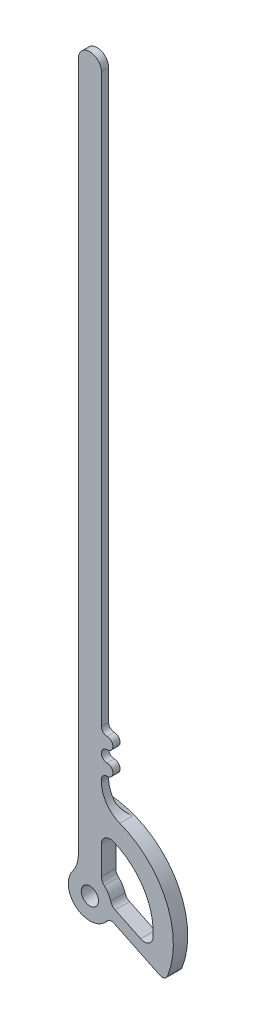
ISO-10303-21;
HEADER;
FILE_DESCRIPTION(('STEP AP214'),'2;1');
FILE_NAME('part.step','',(''),(''),'','','');
FILE_SCHEMA(('AUTOMOTIVE_DESIGN { 1 0 10303 214 1 1 1 1 }'));
ENDSEC;
DATA;
#1=APPLICATION_CONTEXT('core data for automotive mechanical design processes');
#2=APPLICATION_PROTOCOL_DEFINITION('international standard','automotive_design',2000,#1);
#3=PRODUCT_CONTEXT('',#1,'mechanical');
#4=PRODUCT('Part','Part','',(#3));
#5=PRODUCT_RELATED_PRODUCT_CATEGORY('part','',(#4));
#6=PRODUCT_DEFINITION_FORMATION('','',#4);
#7=PRODUCT_DEFINITION_CONTEXT('part definition',#1,'design');
#8=PRODUCT_DEFINITION('design','',#6,#7);
#9=PRODUCT_DEFINITION_SHAPE('','',#8);
#10=(LENGTH_UNIT() NAMED_UNIT(*) SI_UNIT(.MILLI.,.METRE.));
#11=(NAMED_UNIT(*) PLANE_ANGLE_UNIT() SI_UNIT($,.RADIAN.));
#12=(NAMED_UNIT(*) SI_UNIT($,.STERADIAN.) SOLID_ANGLE_UNIT());
#13=UNCERTAINTY_MEASURE_WITH_UNIT(LENGTH_MEASURE(1.E-05),#10,'distance_accuracy_value','');
#14=(GEOMETRIC_REPRESENTATION_CONTEXT(3) GLOBAL_UNCERTAINTY_ASSIGNED_CONTEXT((#13)) GLOBAL_UNIT_ASSIGNED_CONTEXT((#10,
#11,#12)) REPRESENTATION_CONTEXT('',''));
#15=CARTESIAN_POINT('',(0.,0.,0.));
#16=DIRECTION('',(0.,0.,1.));
#17=DIRECTION('',(1.,0.,0.));
#18=AXIS2_PLACEMENT_3D('',#15,#16,#17);
#19=CARTESIAN_POINT('',(4.,0.,-247.784889177542));
#20=DIRECTION('',(1.,0.,0.));
#21=DIRECTION('',(0.,0.,-1.));
#22=AXIS2_PLACEMENT_3D('',#19,#20,#21);
#23=PLANE('',#22);
#24=DIRECTION('',(0.,-1.,0.));
#25=VECTOR('',#24,1.);
#26=CARTESIAN_POINT('',(4.,0.,2.5));
#27=LINE('',#26,#25);
#28=CARTESIAN_POINT('',(4.,37.,2.5));
#29=VERTEX_POINT('',#28);
#30=CARTESIAN_POINT('',(4.,36.4005494464036,2.5));
#31=VERTEX_POINT('',#30);
#32=EDGE_CURVE('E629',#29,#31,#27,.T.);
#33=ORIENTED_EDGE('',*,*,#32,.F.);
#34=DIRECTION('',(0.,0.,1.));
#35=VECTOR('',#34,1.);
#36=CARTESIAN_POINT('',(4.,37.,-247.784889177542));
#37=LINE('',#36,#35);
#38=CARTESIAN_POINT('',(4.,37.,5.));
#39=VERTEX_POINT('',#38);
#40=EDGE_CURVE('E276',#29,#39,#37,.T.);
#41=ORIENTED_EDGE('',*,*,#40,.T.);
#42=DIRECTION('',(0.,1.,0.));
#43=VECTOR('',#42,1.);
#44=CARTESIAN_POINT('',(4.,0.,5.));
#45=LINE('',#44,#43);
#46=CARTESIAN_POINT('',(4.,36.4005494464036,5.));
#47=VERTEX_POINT('',#46);
#48=EDGE_CURVE('E294',#47,#39,#45,.T.);
#49=ORIENTED_EDGE('',*,*,#48,.F.);
#50=DIRECTION('',(0.,0.,-1.));
#51=VECTOR('',#50,1.);
#52=CARTESIAN_POINT('',(4.,36.4005494464036,-247.784889177542));
#53=LINE('',#52,#51);
#54=EDGE_CURVE('E378',#47,#31,#53,.T.);
#55=ORIENTED_EDGE('',*,*,#54,.T.);
#56=EDGE_LOOP('',(#33,#41,#49,#55));
#57=FACE_BOUND('',#56,.T.);
#58=ADVANCED_FACE('F47',(#57),#23,.T.);
#59=CARTESIAN_POINT('',(4.,53.,5.));
#60=VERTEX_POINT('',#59);
#61=CARTESIAN_POINT('',(4.,250.,5.));
#62=VERTEX_POINT('',#61);
#63=EDGE_CURVE('E301',#60,#62,#45,.T.);
#64=ORIENTED_EDGE('',*,*,#63,.F.);
#65=DIRECTION('',(0.,0.,1.));
#66=VECTOR('',#65,1.);
#67=CARTESIAN_POINT('',(4.,53.,-247.784889177542));
#68=LINE('',#67,#66);
#69=CARTESIAN_POINT('',(4.,53.,2.5));
#70=VERTEX_POINT('',#69);
#71=EDGE_CURVE('E281',#60,#70,#68,.F.);
#72=ORIENTED_EDGE('',*,*,#71,.T.);
#73=CARTESIAN_POINT('',(4.,250.,2.5));
#74=VERTEX_POINT('',#73);
#75=EDGE_CURVE('E612',#74,#70,#27,.T.);
#76=ORIENTED_EDGE('',*,*,#75,.F.);
#77=DIRECTION('',(0.,0.,1.));
#78=VECTOR('',#77,1.);
#79=CARTESIAN_POINT('',(4.,250.,-247.784889177542));
#80=LINE('',#79,#78);
#81=EDGE_CURVE('E314',#74,#62,#80,.T.);
#82=ORIENTED_EDGE('',*,*,#81,.T.);
#83=EDGE_LOOP('',(#64,#72,#76,#82));
#84=FACE_BOUND('',#83,.T.);
#85=ADVANCED_FACE('F513',(#84),#23,.T.);
#86=CARTESIAN_POINT('',(2.69287587756797E-12,0.,0.));
#87=DIRECTION('',(0.,0.,1.));
#88=DIRECTION('',(1.,0.,0.));
#89=AXIS2_PLACEMENT_3D('',#86,#87,#88);
#90=PLANE('',#89);
#91=CARTESIAN_POINT('',(0.,0.,0.));
#92=DIRECTION('',(0.,0.,1.));
#93=DIRECTION('',(1.,0.,0.));
#94=AXIS2_PLACEMENT_3D('',#91,#92,#93);
#95=CIRCLE('',#94,7.5);
#96=CARTESIAN_POINT('',(7.20644694761719,2.07776860867107,0.));
#97=VERTEX_POINT('',#96);
#98=CARTESIAN_POINT('',(5.,5.59016994374947,0.));
#99=VERTEX_POINT('',#98);
#100=EDGE_CURVE('E306',#97,#99,#95,.T.);
#101=ORIENTED_EDGE('',*,*,#100,.F.);
#102=CARTESIAN_POINT('',(10.0890257266641,2.9088760521395,0.));
#103=DIRECTION('',(0.,0.,1.));
#104=DIRECTION('',(1.,0.,0.));
#105=AXIS2_PLACEMENT_3D('',#102,#103,#104);
#106=CIRCLE('',#105,3.);
#107=CARTESIAN_POINT('',(8.7867774540333,0.206257056344831,0.));
#108=VERTEX_POINT('',#107);
#109=EDGE_CURVE('E439',#97,#108,#106,.T.);
#110=ORIENTED_EDGE('',*,*,#109,.T.);
#111=DIRECTION('',(0.900872998598224,-0.434082757543587,0.));
#112=VECTOR('',#111,1.);
#113=CARTESIAN_POINT('',(1.73633103017435,3.6034919943929,0.));
#114=LINE('',#113,#112);
#115=CARTESIAN_POINT('',(17.6489208192768,-4.06393822724936,0.));
#116=VERTEX_POINT('',#115);
#117=EDGE_CURVE('E603',#108,#116,#114,.T.);
#118=ORIENTED_EDGE('',*,*,#117,.T.);
#119=CARTESIAN_POINT('',(18.9511690919075,-1.36131923145469,0.));
#120=DIRECTION('',(0.,0.,1.));
#121=DIRECTION('',(1.,0.,0.));
#122=AXIS2_PLACEMENT_3D('',#119,#120,#121);
#123=CIRCLE('',#122,3.);
#124=CARTESIAN_POINT('',(21.9434589485245,-1.57626437326332,0.));
#125=VERTEX_POINT('',#124);
#126=EDGE_CURVE('E433',#116,#125,#123,.T.);
#127=ORIENTED_EDGE('',*,*,#126,.T.);
#128=CARTESIAN_POINT('',(0.,0.,0.));
#129=DIRECTION('',(0.,0.,1.));
#130=DIRECTION('',(1.,0.,0.));
#131=AXIS2_PLACEMENT_3D('',#128,#129,#130);
#132=CIRCLE('',#131,22.);
#133=CARTESIAN_POINT('',(8.10526315789474,20.4524988483382,0.));
#134=VERTEX_POINT('',#133);
#135=EDGE_CURVE('E591',#125,#134,#132,.T.);
#136=ORIENTED_EDGE('',*,*,#135,.T.);
#137=CARTESIAN_POINT('',(7.,17.6635217326557,0.));
#138=DIRECTION('',(0.,0.,1.));
#139=DIRECTION('',(1.,0.,0.));
#140=AXIS2_PLACEMENT_3D('',#137,#138,#139);
#141=CIRCLE('',#140,3.);
#142=CARTESIAN_POINT('',(4.,17.6635217326557,0.));
#143=VERTEX_POINT('',#142);
#144=EDGE_CURVE('E445',#134,#143,#141,.T.);
#145=ORIENTED_EDGE('',*,*,#144,.T.);
#146=DIRECTION('',(0.,1.,0.));
#147=VECTOR('',#146,1.);
#148=CARTESIAN_POINT('',(4.,0.,0.));
#149=LINE('',#148,#147);
#150=CARTESIAN_POINT('',(4.,7.82623792124926,0.));
#151=VERTEX_POINT('',#150);
#152=EDGE_CURVE('E588',#151,#143,#149,.T.);
#153=ORIENTED_EDGE('',*,*,#152,.F.);
#154=CARTESIAN_POINT('',(7.,7.82623792124926,0.));
#155=DIRECTION('',(0.,0.,1.));
#156=DIRECTION('',(1.,0.,0.));
#157=AXIS2_PLACEMENT_3D('',#154,#155,#156);
#158=CIRCLE('',#157,3.);
#159=EDGE_CURVE('E427',#151,#99,#158,.T.);
#160=ORIENTED_EDGE('',*,*,#159,.T.);
#161=EDGE_LOOP('',(#101,#110,#118,#127,#136,#145,#153,#160));
#162=FACE_BOUND('',#161,.T.);
#163=CARTESIAN_POINT('',(2.69287587756797E-12,0.,0.));
#164=DIRECTION('',(0.,0.,1.));
#165=DIRECTION('',(1.,0.,0.));
#166=AXIS2_PLACEMENT_3D('',#163,#164,#165);
#167=CIRCLE('',#166,2.99999999999804);
#168=CARTESIAN_POINT('',(3.00000000000073,0.,0.));
#169=VERTEX_POINT('',#168);
#170=EDGE_CURVE('E324',#169,#169,#167,.T.);
#171=ORIENTED_EDGE('',*,*,#170,.T.);
#172=EDGE_LOOP('',(#171));
#173=FACE_BOUND('',#172,.T.);
#174=DIRECTION('',(0.,-1.,0.));
#175=VECTOR('',#174,1.);
#176=CARTESIAN_POINT('',(-4.,0.,0.));
#177=LINE('',#176,#175);
#178=CARTESIAN_POINT('',(-4.,26.9258240356723,0.));
#179=VERTEX_POINT('',#178);
#180=CARTESIAN_POINT('',(-4.,10.4999999999964,0.));
#181=VERTEX_POINT('',#180);
#182=EDGE_CURVE('E308',#179,#181,#177,.T.);
#183=ORIENTED_EDGE('',*,*,#182,.F.);
#184=CARTESIAN_POINT('',(-2.,26.9258240356723,0.));
#185=DIRECTION('',(0.,0.,1.));
#186=DIRECTION('',(1.,0.,0.));
#187=AXIS2_PLACEMENT_3D('',#184,#185,#186);
#188=CIRCLE('',#187,2.);
#189=CARTESIAN_POINT('',(-2.14814814814835,28.9203295197962,0.));
#190=VERTEX_POINT('',#189);
#191=EDGE_CURVE('E451',#179,#190,#188,.F.);
#192=ORIENTED_EDGE('',*,*,#191,.T.);
#193=CARTESIAN_POINT('',(2.69287587756797E-12,0.,0.));
#194=DIRECTION('',(0.,0.,1.));
#195=DIRECTION('',(1.,0.,0.));
#196=AXIS2_PLACEMENT_3D('',#193,#194,#195);
#197=CIRCLE('',#196,29.);
#198=CARTESIAN_POINT('',(26.9860180467103,-10.6186077233681,0.));
#199=VERTEX_POINT('',#198);
#200=EDGE_CURVE('E332',#199,#190,#197,.T.);
#201=ORIENTED_EDGE('',*,*,#200,.F.);
#202=CARTESIAN_POINT('',(25.1249133538339,-9.88628994934276,0.));
#203=DIRECTION('',(0.,0.,1.));
#204=DIRECTION('',(1.,0.,0.));
#205=AXIS2_PLACEMENT_3D('',#202,#203,#204);
#206=CIRCLE('',#205,2.);
#207=CARTESIAN_POINT('',(24.2567478387466,-11.6880359465392,0.));
#208=VERTEX_POINT('',#207);
#209=EDGE_CURVE('E362',#199,#208,#206,.F.);
#210=ORIENTED_EDGE('',*,*,#209,.T.);
#211=DIRECTION('',(0.900872998598205,-0.434082757543626,0.));
#212=VECTOR('',#211,1.);
#213=CARTESIAN_POINT('',(6.75654748948923,-3.25562068157719,0.));
#214=LINE('',#213,#212);
#215=CARTESIAN_POINT('',(8.36648664409569,-4.03136468633309,0.));
#216=VERTEX_POINT('',#215);
#217=EDGE_CURVE('E341',#216,#208,#214,.T.);
#218=ORIENTED_EDGE('',*,*,#217,.F.);
#219=CARTESIAN_POINT('',(7.49832112900844,-5.8331106835295,0.));
#220=DIRECTION('',(0.,0.,1.));
#221=DIRECTION('',(1.,0.,0.));
#222=AXIS2_PLACEMENT_3D('',#219,#220,#221);
#223=CIRCLE('',#222,2.);
#224=CARTESIAN_POINT('',(5.91972720711249,-4.60508738173382,0.));
#225=VERTEX_POINT('',#224);
#226=EDGE_CURVE('E368',#216,#225,#223,.T.);
#227=ORIENTED_EDGE('',*,*,#226,.T.);
#228=CARTESIAN_POINT('',(2.69287587756797E-12,0.,0.));
#229=DIRECTION('',(0.,0.,1.));
#230=DIRECTION('',(1.,0.,0.));
#231=AXIS2_PLACEMENT_3D('',#228,#229,#230);
#232=CIRCLE('',#231,7.5);
#233=CARTESIAN_POINT('',(-5.99999999999846,4.49999999999846,0.));
#234=VERTEX_POINT('',#233);
#235=EDGE_CURVE('E323',#234,#225,#232,.T.);
#236=ORIENTED_EDGE('',*,*,#235,.F.);
#237=CARTESIAN_POINT('',(-14.,10.4999999999964,0.));
#238=DIRECTION('',(0.,0.,1.));
#239=DIRECTION('',(1.,0.,0.));
#240=AXIS2_PLACEMENT_3D('',#237,#238,#239);
#241=CIRCLE('',#240,10.);
#242=EDGE_CURVE('E392',#234,#181,#241,.T.);
#243=ORIENTED_EDGE('',*,*,#242,.T.);
#244=EDGE_LOOP('',(#183,#192,#201,#210,#218,#227,#236,#243));
#245=FACE_BOUND('',#244,.T.);
#246=ADVANCED_FACE('F518',(#162,#173,#245),#90,.F.);
#247=CARTESIAN_POINT('',(0.,250.,-247.784889177542));
#248=DIRECTION('',(0.,0.,1.));
#249=DIRECTION('',(1.,0.,0.));
#250=AXIS2_PLACEMENT_3D('',#247,#248,#249);
#251=CYLINDRICAL_SURFACE('',#250,4.);
#252=ORIENTED_EDGE('',*,*,#81,.F.);
#253=CARTESIAN_POINT('',(0.,250.,2.5));
#254=DIRECTION('',(0.,0.,-1.));
#255=DIRECTION('',(-1.,0.,0.));
#256=AXIS2_PLACEMENT_3D('',#253,#254,#255);
#257=CIRCLE('',#256,4.);
#258=CARTESIAN_POINT('',(-4.,250.,2.5));
#259=VERTEX_POINT('',#258);
#260=EDGE_CURVE('E630',#259,#74,#257,.T.);
#261=ORIENTED_EDGE('',*,*,#260,.F.);
#262=DIRECTION('',(0.,0.,1.));
#263=VECTOR('',#262,1.);
#264=CARTESIAN_POINT('',(-4.,250.,-247.784889177542));
#265=LINE('',#264,#263);
#266=CARTESIAN_POINT('',(-4.,250.,5.));
#267=VERTEX_POINT('',#266);
#268=EDGE_CURVE('E315',#259,#267,#265,.T.);
#269=ORIENTED_EDGE('',*,*,#268,.T.);
#270=CARTESIAN_POINT('',(0.,250.,5.));
#271=DIRECTION('',(0.,0.,1.));
#272=DIRECTION('',(1.,0.,0.));
#273=AXIS2_PLACEMENT_3D('',#270,#271,#272);
#274=CIRCLE('',#273,4.);
#275=EDGE_CURVE('E300',#62,#267,#274,.T.);
#276=ORIENTED_EDGE('',*,*,#275,.F.);
#277=EDGE_LOOP('',(#252,#261,#269,#276));
#278=FACE_BOUND('',#277,.T.);
#279=ADVANCED_FACE('F521',(#278),#251,.T.);
#280=CARTESIAN_POINT('',(14.,36.4005494464036,5.));
#281=DIRECTION('',(0.,0.,-1.));
#282=DIRECTION('',(-1.,0.,0.));
#283=AXIS2_PLACEMENT_3D('',#280,#281,#282);
#284=CYLINDRICAL_SURFACE('',#283,10.);
#285=CARTESIAN_POINT('',(14.,36.4005494464036,2.5));
#286=DIRECTION('',(0.,0.,-1.));
#287=DIRECTION('',(-1.,0.,0.));
#288=AXIS2_PLACEMENT_3D('',#285,#286,#287);
#289=CIRCLE('',#288,10.);
#290=CARTESIAN_POINT('',(5.98835494559473,30.4161076577133,2.5));
#291=VERTEX_POINT('',#290);
#292=EDGE_CURVE('E634',#31,#291,#289,.F.);
#293=ORIENTED_EDGE('',*,*,#292,.F.);
#294=ORIENTED_EDGE('',*,*,#54,.F.);
#295=CARTESIAN_POINT('',(14.,36.4005494464036,5.));
#296=DIRECTION('',(0.,0.,1.));
#297=DIRECTION('',(1.,0.,0.));
#298=AXIS2_PLACEMENT_3D('',#295,#296,#297);
#299=CIRCLE('',#298,10.);
#300=CARTESIAN_POINT('',(10.4102564102571,27.0670752293771,5.));
#301=VERTEX_POINT('',#300);
#302=EDGE_CURVE('E297',#301,#47,#299,.F.);
#303=ORIENTED_EDGE('',*,*,#302,.F.);
#304=DIRECTION('',(0.,0.,-1.));
#305=VECTOR('',#304,1.);
#306=CARTESIAN_POINT('',(10.4102564102571,27.0670752293771,5.));
#307=LINE('',#306,#305);
#308=CARTESIAN_POINT('',(10.4102564102571,27.0670752293771,0.5));
#309=VERTEX_POINT('',#308);
#310=EDGE_CURVE('E375',#309,#301,#307,.F.);
#311=ORIENTED_EDGE('',*,*,#310,.F.);
#312=CARTESIAN_POINT('',(5.98835494559472,30.4161076577133,2.5));
#313=CARTESIAN_POINT('',(6.06925405762394,30.3077742408171,2.49995190357718));
#314=CARTESIAN_POINT('',(6.15228611807816,30.2012260528204,2.49384101835242));
#315=CARTESIAN_POINT('',(6.32184825433212,29.9924346777865,2.47123797254335));
#316=CARTESIAN_POINT('',(6.40837057256933,29.8901828744651,2.45476776281015));
#317=CARTESIAN_POINT('',(6.58370940894421,29.691145314492,2.41336042817435));
#318=CARTESIAN_POINT('',(6.67249870460525,29.5943190563328,2.3884998506774));
#319=CARTESIAN_POINT('',(6.85274752973702,29.4052761709589,2.33160605976266));
#320=CARTESIAN_POINT('',(6.9442088868756,29.313062821679,2.29956783204339));
#321=CARTESIAN_POINT('',(7.19646405991991,29.0683353698712,2.20413386144462));
#322=CARTESIAN_POINT('',(7.35954262184815,28.9204648547703,2.13482182792853));
#323=CARTESIAN_POINT('',(7.69139801420434,28.6385258619691,1.98308128976261));
#324=CARTESIAN_POINT('',(7.86017780672204,28.5044647101085,1.90064588161173));
#325=CARTESIAN_POINT('',(8.2036039528961,28.2489958741337,1.7257627779787));
#326=CARTESIAN_POINT('',(8.37827618873322,28.1276574077541,1.63326538149455));
#327=CARTESIAN_POINT('',(8.73219253245133,27.8979203744389,1.44148728812823));
#328=CARTESIAN_POINT('',(8.91143517435556,27.7895177201088,1.3422087495917));
#329=CARTESIAN_POINT('',(9.30428585534102,27.5682710213277,1.12243449354019));
#330=CARTESIAN_POINT('',(9.51868918577539,27.4576392339267,1.00113852639561));
#331=CARTESIAN_POINT('',(9.95305788991437,27.2528846986253,0.755868891533057));
#332=CARTESIAN_POINT('',(10.1730102284988,27.1587267560106,0.631901583824298));
#333=CARTESIAN_POINT('',(10.4007315485907,27.0707427734298,0.505293313316028));
#334=CARTESIAN_POINT('',(10.4054932936564,27.0689071754453,0.50264664819935));
#335=CARTESIAN_POINT('',(10.4102564102571,27.0670752293771,0.5));
#336=B_SPLINE_CURVE_WITH_KNOTS('',3,(#312,#313,#314,#315,#316,#317,#318,#319,#320,#321,#322,
#323,#324,#325,#326,#327,#328,#329,#330,#331,#332,#333,#334,#335),.UNSPECIFIED.,.F.,.F.,(4,2,2,
2,2,2,2,2,2,2,2,4),(0.,0.405235878062857,0.809615962602358,1.21040226899694,1.61146944237907,
2.30271912013183,2.9943336360746,3.689534437942,4.38451498873265,5.19403024713252,
6.00179435939041,6.01904069334347),.UNSPECIFIED.);
#337=EDGE_CURVE('E285',#309,#291,#336,.F.);
#338=ORIENTED_EDGE('',*,*,#337,.T.);
#339=EDGE_LOOP('',(#293,#294,#303,#311,#338));
#340=FACE_BOUND('',#339,.T.);
#341=ADVANCED_FACE('F543',(#340),#284,.F.);
#342=CARTESIAN_POINT('',(2.69287587756797E-12,0.,5.));
#343=DIRECTION('',(0.,0.,-1.));
#344=DIRECTION('',(-1.,0.,0.));
#345=AXIS2_PLACEMENT_3D('',#342,#343,#344);
#346=CYLINDRICAL_SURFACE('',#345,7.5);
#347=CARTESIAN_POINT('',(2.69287587756797E-12,0.,5.));
#348=DIRECTION('',(0.,0.,1.));
#349=DIRECTION('',(1.,0.,0.));
#350=AXIS2_PLACEMENT_3D('',#347,#348,#349);
#351=CIRCLE('',#350,7.5);
#352=CARTESIAN_POINT('',(-5.99999999999846,4.49999999999846,5.));
#353=VERTEX_POINT('',#352);
#354=CARTESIAN_POINT('',(5.91972720711249,-4.60508738173382,5.));
#355=VERTEX_POINT('',#354);
#356=EDGE_CURVE('E328',#353,#355,#351,.T.);
#357=ORIENTED_EDGE('',*,*,#356,.F.);
#358=DIRECTION('',(0.,0.,-1.));
#359=VECTOR('',#358,1.);
#360=CARTESIAN_POINT('',(-5.99999999999846,4.49999999999846,5.));
#361=LINE('',#360,#359);
#362=EDGE_CURVE('E384',#353,#234,#361,.T.);
#363=ORIENTED_EDGE('',*,*,#362,.T.);
#364=ORIENTED_EDGE('',*,*,#235,.T.);
#365=DIRECTION('',(0.,0.,-1.));
#366=VECTOR('',#365,1.);
#367=CARTESIAN_POINT('',(5.91972720711249,-4.60508738173382,5.));
#368=LINE('',#367,#366);
#369=EDGE_CURVE('E354',#225,#355,#368,.F.);
#370=ORIENTED_EDGE('',*,*,#369,.T.);
#371=EDGE_LOOP('',(#357,#363,#364,#370));
#372=FACE_BOUND('',#371,.T.);
#373=ADVANCED_FACE('F530',(#372),#346,.T.);
#374=CARTESIAN_POINT('',(2.69287587756797E-12,0.,5.));
#375=DIRECTION('',(0.,0.,1.));
#376=DIRECTION('',(1.,0.,0.));
#377=AXIS2_PLACEMENT_3D('',#374,#375,#376);
#378=PLANE('',#377);
#379=DIRECTION('',(0.900872998598224,-0.434082757543587,0.));
#380=VECTOR('',#379,1.);
#381=CARTESIAN_POINT('',(1.73633103017435,3.6034919943929,5.));
#382=LINE('',#381,#380);
#383=CARTESIAN_POINT('',(8.7867774540333,0.206257056344831,5.));
#384=VERTEX_POINT('',#383);
#385=CARTESIAN_POINT('',(17.6489208192768,-4.06393822724936,5.));
#386=VERTEX_POINT('',#385);
#387=EDGE_CURVE('E607',#384,#386,#382,.T.);
#388=ORIENTED_EDGE('',*,*,#387,.F.);
#389=CARTESIAN_POINT('',(10.0890257266641,2.9088760521395,5.));
#390=DIRECTION('',(0.,0.,1.));
#391=DIRECTION('',(1.,0.,0.));
#392=AXIS2_PLACEMENT_3D('',#389,#390,#391);
#393=CIRCLE('',#392,3.);
#394=CARTESIAN_POINT('',(7.20644694761719,2.07776860867107,5.));
#395=VERTEX_POINT('',#394);
#396=EDGE_CURVE('E436',#384,#395,#393,.F.);
#397=ORIENTED_EDGE('',*,*,#396,.T.);
#398=CARTESIAN_POINT('',(0.,0.,5.));
#399=DIRECTION('',(0.,0.,1.));
#400=DIRECTION('',(1.,0.,0.));
#401=AXIS2_PLACEMENT_3D('',#398,#399,#400);
#402=CIRCLE('',#401,7.5);
#403=CARTESIAN_POINT('',(5.,5.59016994374947,5.));
#404=VERTEX_POINT('',#403);
#405=EDGE_CURVE('E618',#395,#404,#402,.T.);
#406=ORIENTED_EDGE('',*,*,#405,.T.);
#407=CARTESIAN_POINT('',(7.,7.82623792124926,5.));
#408=DIRECTION('',(0.,0.,1.));
#409=DIRECTION('',(1.,0.,0.));
#410=AXIS2_PLACEMENT_3D('',#407,#408,#409);
#411=CIRCLE('',#410,3.);
#412=CARTESIAN_POINT('',(4.,7.82623792124926,5.));
#413=VERTEX_POINT('',#412);
#414=EDGE_CURVE('E424',#404,#413,#411,.F.);
#415=ORIENTED_EDGE('',*,*,#414,.T.);
#416=DIRECTION('',(0.,1.,0.));
#417=VECTOR('',#416,1.);
#418=CARTESIAN_POINT('',(4.,0.,5.));
#419=LINE('',#418,#417);
#420=CARTESIAN_POINT('',(4.,17.6635217326557,5.));
#421=VERTEX_POINT('',#420);
#422=EDGE_CURVE('E616',#413,#421,#419,.T.);
#423=ORIENTED_EDGE('',*,*,#422,.T.);
#424=CARTESIAN_POINT('',(7.,17.6635217326557,5.));
#425=DIRECTION('',(0.,0.,1.));
#426=DIRECTION('',(1.,0.,0.));
#427=AXIS2_PLACEMENT_3D('',#424,#425,#426);
#428=CIRCLE('',#427,3.);
#429=CARTESIAN_POINT('',(8.10526315789474,20.4524988483382,5.));
#430=VERTEX_POINT('',#429);
#431=EDGE_CURVE('E442',#421,#430,#428,.F.);
#432=ORIENTED_EDGE('',*,*,#431,.T.);
#433=CARTESIAN_POINT('',(0.,0.,5.));
#434=DIRECTION('',(0.,0.,1.));
#435=DIRECTION('',(1.,0.,0.));
#436=AXIS2_PLACEMENT_3D('',#433,#434,#435);
#437=CIRCLE('',#436,22.);
#438=CARTESIAN_POINT('',(21.9434589485245,-1.57626437326332,5.));
#439=VERTEX_POINT('',#438);
#440=EDGE_CURVE('E611',#439,#430,#437,.T.);
#441=ORIENTED_EDGE('',*,*,#440,.F.);
#442=CARTESIAN_POINT('',(18.9511690919075,-1.36131923145469,5.));
#443=DIRECTION('',(0.,0.,1.));
#444=DIRECTION('',(1.,0.,0.));
#445=AXIS2_PLACEMENT_3D('',#442,#443,#444);
#446=CIRCLE('',#445,3.);
#447=EDGE_CURVE('E430',#439,#386,#446,.F.);
#448=ORIENTED_EDGE('',*,*,#447,.T.);
#449=EDGE_LOOP('',(#388,#397,#406,#415,#423,#432,#441,#448));
#450=FACE_BOUND('',#449,.T.);
#451=DIRECTION('',(0.900872998598205,-0.434082757543626,0.));
#452=VECTOR('',#451,1.);
#453=CARTESIAN_POINT('',(6.75654748948923,-3.25562068157719,5.));
#454=LINE('',#453,#452);
#455=CARTESIAN_POINT('',(8.36648664409569,-4.03136468633309,5.));
#456=VERTEX_POINT('',#455);
#457=CARTESIAN_POINT('',(24.2567478387466,-11.6880359465392,5.));
#458=VERTEX_POINT('',#457);
#459=EDGE_CURVE('E331',#456,#458,#454,.T.);
#460=ORIENTED_EDGE('',*,*,#459,.T.);
#461=CARTESIAN_POINT('',(25.1249133538339,-9.88628994934276,5.));
#462=DIRECTION('',(0.,0.,1.));
#463=DIRECTION('',(1.,0.,0.));
#464=AXIS2_PLACEMENT_3D('',#461,#462,#463);
#465=CIRCLE('',#464,2.);
#466=CARTESIAN_POINT('',(26.9860180467103,-10.6186077233681,5.));
#467=VERTEX_POINT('',#466);
#468=EDGE_CURVE('E365',#458,#467,#465,.T.);
#469=ORIENTED_EDGE('',*,*,#468,.T.);
#470=CARTESIAN_POINT('',(2.69287587756797E-12,0.,5.));
#471=DIRECTION('',(0.,0.,1.));
#472=DIRECTION('',(1.,0.,0.));
#473=AXIS2_PLACEMENT_3D('',#470,#471,#472);
#474=CIRCLE('',#473,29.);
#475=EDGE_CURVE('E335',#467,#301,#474,.T.);
#476=ORIENTED_EDGE('',*,*,#475,.T.);
#477=ORIENTED_EDGE('',*,*,#302,.T.);
#478=ORIENTED_EDGE('',*,*,#48,.T.);
#479=CARTESIAN_POINT('',(6.,37.,5.));
#480=DIRECTION('',(0.,0.,1.));
#481=DIRECTION('',(1.,0.,0.));
#482=AXIS2_PLACEMENT_3D('',#479,#480,#481);
#483=CIRCLE('',#482,2.);
#484=CARTESIAN_POINT('',(6.00000000000001,39.,5.));
#485=VERTEX_POINT('',#484);
#486=EDGE_CURVE('E55',#39,#485,#483,.F.);
#487=ORIENTED_EDGE('',*,*,#486,.T.);
#488=CARTESIAN_POINT('',(6.00000000000001,41.,5.));
#489=DIRECTION('',(0.,0.,1.));
#490=DIRECTION('',(1.,0.,0.));
#491=AXIS2_PLACEMENT_3D('',#488,#489,#490);
#492=CIRCLE('',#491,2.);
#493=CARTESIAN_POINT('',(6.00000000000001,43.,5.));
#494=VERTEX_POINT('',#493);
#495=EDGE_CURVE('E269',#485,#494,#492,.T.);
#496=ORIENTED_EDGE('',*,*,#495,.T.);
#497=CARTESIAN_POINT('',(6.00000000000001,45.,5.));
#498=DIRECTION('',(0.,0.,1.));
#499=DIRECTION('',(1.,0.,0.));
#500=AXIS2_PLACEMENT_3D('',#497,#498,#499);
#501=CIRCLE('',#500,2.);
#502=CARTESIAN_POINT('',(6.00000000000001,47.,5.));
#503=VERTEX_POINT('',#502);
#504=EDGE_CURVE('E641',#503,#494,#501,.T.);
#505=ORIENTED_EDGE('',*,*,#504,.F.);
#506=CARTESIAN_POINT('',(6.00000000000001,49.,5.));
#507=DIRECTION('',(0.,0.,1.));
#508=DIRECTION('',(1.,0.,0.));
#509=AXIS2_PLACEMENT_3D('',#506,#507,#508);
#510=CIRCLE('',#509,2.);
#511=CARTESIAN_POINT('',(6.00000000000001,51.,5.));
#512=VERTEX_POINT('',#511);
#513=EDGE_CURVE('E647',#503,#512,#510,.T.);
#514=ORIENTED_EDGE('',*,*,#513,.T.);
#515=CARTESIAN_POINT('',(6.,53.,5.));
#516=DIRECTION('',(0.,0.,1.));
#517=DIRECTION('',(1.,0.,0.));
#518=AXIS2_PLACEMENT_3D('',#515,#516,#517);
#519=CIRCLE('',#518,2.);
#520=EDGE_CURVE('E280',#512,#60,#519,.F.);
#521=ORIENTED_EDGE('',*,*,#520,.T.);
#522=ORIENTED_EDGE('',*,*,#63,.T.);
#523=ORIENTED_EDGE('',*,*,#275,.T.);
#524=DIRECTION('',(0.,1.,0.));
#525=VECTOR('',#524,1.);
#526=CARTESIAN_POINT('',(-4.,0.,5.));
#527=LINE('',#526,#525);
#528=CARTESIAN_POINT('',(-4.,10.4999999999964,5.));
#529=VERTEX_POINT('',#528);
#530=EDGE_CURVE('E304',#529,#267,#527,.T.);
#531=ORIENTED_EDGE('',*,*,#530,.F.);
#532=CARTESIAN_POINT('',(-14.,10.4999999999964,5.));
#533=DIRECTION('',(0.,0.,1.));
#534=DIRECTION('',(1.,0.,0.));
#535=AXIS2_PLACEMENT_3D('',#532,#533,#534);
#536=CIRCLE('',#535,10.);
#537=EDGE_CURVE('E389',#529,#353,#536,.F.);
#538=ORIENTED_EDGE('',*,*,#537,.T.);
#539=ORIENTED_EDGE('',*,*,#356,.T.);
#540=CARTESIAN_POINT('',(7.49832112900844,-5.8331106835295,5.));
#541=DIRECTION('',(0.,0.,1.));
#542=DIRECTION('',(1.,0.,0.));
#543=AXIS2_PLACEMENT_3D('',#540,#541,#542);
#544=CIRCLE('',#543,2.);
#545=EDGE_CURVE('E372',#355,#456,#544,.F.);
#546=ORIENTED_EDGE('',*,*,#545,.T.);
#547=EDGE_LOOP('',(#460,#469,#476,#477,#478,#487,#496,#505,#514,#521,#522,#523,#531,#538,#539,#546));
#548=FACE_BOUND('',#547,.T.);
#549=CARTESIAN_POINT('',(2.69287587756797E-12,0.,5.));
#550=DIRECTION('',(0.,0.,1.));
#551=DIRECTION('',(1.,0.,0.));
#552=AXIS2_PLACEMENT_3D('',#549,#550,#551);
#553=CIRCLE('',#552,2.99999999999804);
#554=CARTESIAN_POINT('',(3.00000000000073,0.,5.));
#555=VERTEX_POINT('',#554);
#556=EDGE_CURVE('E319',#555,#555,#553,.T.);
#557=ORIENTED_EDGE('',*,*,#556,.F.);
#558=EDGE_LOOP('',(#557));
#559=FACE_BOUND('',#558,.T.);
#560=ADVANCED_FACE('F291',(#450,#548,#559),#378,.T.);
#561=CARTESIAN_POINT('',(6.75654748948923,-3.25562068157719,5.));
#562=DIRECTION('',(0.434082757543626,0.900872998598205,0.));
#563=DIRECTION('',(-0.900872998598205,0.434082757543626,0.));
#564=AXIS2_PLACEMENT_3D('',#561,#562,#563);
#565=PLANE('',#564);
#566=ORIENTED_EDGE('',*,*,#459,.F.);
#567=DIRECTION('',(0.,0.,1.));
#568=VECTOR('',#567,1.);
#569=CARTESIAN_POINT('',(8.36648664409569,-4.03136468633309,0.));
#570=LINE('',#569,#568);
#571=EDGE_CURVE('E350',#456,#216,#570,.F.);
#572=ORIENTED_EDGE('',*,*,#571,.T.);
#573=ORIENTED_EDGE('',*,*,#217,.T.);
#574=DIRECTION('',(0.,0.,-1.));
#575=VECTOR('',#574,1.);
#576=CARTESIAN_POINT('',(24.2567478387466,-11.6880359465392,5.));
#577=LINE('',#576,#575);
#578=EDGE_CURVE('E338',#208,#458,#577,.F.);
#579=ORIENTED_EDGE('',*,*,#578,.T.);
#580=EDGE_LOOP('',(#566,#572,#573,#579));
#581=FACE_BOUND('',#580,.T.);
#582=ADVANCED_FACE('F529',(#581),#565,.F.);
#583=CARTESIAN_POINT('',(2.69287587756797E-12,0.,5.));
#584=DIRECTION('',(0.,0.,-1.));
#585=DIRECTION('',(-1.,0.,0.));
#586=AXIS2_PLACEMENT_3D('',#583,#584,#585);
#587=CYLINDRICAL_SURFACE('',#586,29.);
#588=DIRECTION('',(0.,0.,-1.));
#589=VECTOR('',#588,1.);
#590=CARTESIAN_POINT('',(-2.14814814814835,28.9203295197962,5.));
#591=LINE('',#590,#589);
#592=CARTESIAN_POINT('',(-2.14814814814835,28.9203295197962,0.5));
#593=VERTEX_POINT('',#592);
#594=EDGE_CURVE('E454',#190,#593,#591,.F.);
#595=ORIENTED_EDGE('',*,*,#594,.T.);
#596=CARTESIAN_POINT('',(2.69287587756797E-12,0.,0.5));
#597=DIRECTION('',(0.,0.,-1.));
#598=DIRECTION('',(-1.,0.,0.));
#599=AXIS2_PLACEMENT_3D('',#596,#597,#598);
#600=CIRCLE('',#599,29.);
#601=EDGE_CURVE('E467',#593,#309,#600,.T.);
#602=ORIENTED_EDGE('',*,*,#601,.T.);
#603=ORIENTED_EDGE('',*,*,#310,.T.);
#604=ORIENTED_EDGE('',*,*,#475,.F.);
#605=DIRECTION('',(0.,0.,-1.));
#606=VECTOR('',#605,1.);
#607=CARTESIAN_POINT('',(26.9860180467103,-10.6186077233682,5.));
#608=LINE('',#607,#606);
#609=EDGE_CURVE('E358',#467,#199,#608,.T.);
#610=ORIENTED_EDGE('',*,*,#609,.T.);
#611=ORIENTED_EDGE('',*,*,#200,.T.);
#612=EDGE_LOOP('',(#595,#602,#603,#604,#610,#611));
#613=FACE_BOUND('',#612,.T.);
#614=ADVANCED_FACE('F525',(#613),#587,.T.);
#615=CARTESIAN_POINT('',(2.69287587756797E-12,0.,5.));
#616=DIRECTION('',(0.,0.,-1.));
#617=DIRECTION('',(-1.,0.,0.));
#618=AXIS2_PLACEMENT_3D('',#615,#616,#617);
#619=CYLINDRICAL_SURFACE('',#618,2.99999999999804);
#620=ORIENTED_EDGE('',*,*,#556,.T.);
#621=EDGE_LOOP('',(#620));
#622=FACE_BOUND('',#621,.T.);
#623=ORIENTED_EDGE('',*,*,#170,.F.);
#624=EDGE_LOOP('',(#623));
#625=FACE_BOUND('',#624,.T.);
#626=ADVANCED_FACE('F522',(#622,#625),#619,.F.);
#627=CARTESIAN_POINT('',(-4.,0.,-247.784889177542));
#628=DIRECTION('',(1.,0.,0.));
#629=DIRECTION('',(0.,0.,-1.));
#630=AXIS2_PLACEMENT_3D('',#627,#628,#629);
#631=PLANE('',#630);
#632=DIRECTION('',(0.,1.,0.));
#633=VECTOR('',#632,1.);
#634=CARTESIAN_POINT('',(-4.,0.,2.5));
#635=LINE('',#634,#633);
#636=CARTESIAN_POINT('',(-4.,30.3899256508101,2.5));
#637=VERTEX_POINT('',#636);
#638=EDGE_CURVE('E632',#637,#259,#635,.T.);
#639=ORIENTED_EDGE('',*,*,#638,.F.);
#640=CARTESIAN_POINT('',(-4.,30.3899256508101,2.5));
#641=CARTESIAN_POINT('',(-4.,30.3042303337966,2.50001184941456));
#642=CARTESIAN_POINT('',(-4.,30.2185850951696,2.49587106024901));
#643=CARTESIAN_POINT('',(-4.,30.0481450604808,2.47985293954623));
#644=CARTESIAN_POINT('',(-4.,29.9633491692887,2.46798738148555));
#645=CARTESIAN_POINT('',(-4.,29.7961071809791,2.43727122693321));
#646=CARTESIAN_POINT('',(-4.,29.7136450824905,2.41850649763212));
#647=CARTESIAN_POINT('',(-4.,29.5504229878365,2.37456117093198));
#648=CARTESIAN_POINT('',(-4.,29.469663824762,2.3493775087196));
#649=CARTESIAN_POINT('',(-4.,29.2805565307588,2.28275294574038));
#650=CARTESIAN_POINT('',(-4.,29.173108192275,2.23874838783236));
#651=CARTESIAN_POINT('',(-4.,28.9625168029457,2.14135428268141));
#652=CARTESIAN_POINT('',(-4.,28.8593772777868,2.08795722921233));
#653=CARTESIAN_POINT('',(-4.,28.5558227034787,1.91546245238966));
#654=CARTESIAN_POINT('',(-4.,28.3621926563479,1.78440934233645));
#655=CARTESIAN_POINT('',(-4.,27.9527077298134,1.4727597695965));
#656=CARTESIAN_POINT('',(-4.,27.7405391868874,1.2875225195179));
#657=CARTESIAN_POINT('',(-4.,27.3296074038676,0.903641546761169));
#658=CARTESIAN_POINT('',(-4.,27.1308338765662,0.705008352095552));
#659=CARTESIAN_POINT('',(-4.,26.9300404038168,0.504216367968862));
#660=CARTESIAN_POINT('',(-4.,26.9279322186737,0.50210818282146));
#661=CARTESIAN_POINT('',(-4.,26.9258240356723,0.5));
#662=B_SPLINE_CURVE_WITH_KNOTS('',3,(#640,#641,#642,#643,#644,#645,#646,#647,#648,#649,#650,
#651,#652,#653,#654,#655,#656,#657,#658,#659,#660,#661),.UNSPECIFIED.,.F.,.F.,(4,2,2,2,2,2,2,2,
2,2,4),(0.,0.256912595777818,0.513434539685066,0.766866291390319,1.02041927520561,
1.36819331305817,1.71624655574921,2.41527069662683,3.25887239086169,4.10181864660848,
4.11076291851909),.UNSPECIFIED.);
#663=CARTESIAN_POINT('',(-4.,26.9258240356723,0.5));
#664=VERTEX_POINT('',#663);
#665=EDGE_CURVE('E471',#637,#664,#662,.T.);
#666=ORIENTED_EDGE('',*,*,#665,.T.);
#667=DIRECTION('',(0.,0.,-1.));
#668=VECTOR('',#667,1.);
#669=CARTESIAN_POINT('',(-4.,26.9258240356723,-247.784889177542));
#670=LINE('',#669,#668);
#671=EDGE_CURVE('E448',#664,#179,#670,.T.);
#672=ORIENTED_EDGE('',*,*,#671,.T.);
#673=ORIENTED_EDGE('',*,*,#182,.T.);
#674=DIRECTION('',(0.,0.,1.));
#675=VECTOR('',#674,1.);
#676=CARTESIAN_POINT('',(-4.,10.4999999999964,5.));
#677=LINE('',#676,#675);
#678=EDGE_CURVE('E380',#181,#529,#677,.T.);
#679=ORIENTED_EDGE('',*,*,#678,.T.);
#680=ORIENTED_EDGE('',*,*,#530,.T.);
#681=ORIENTED_EDGE('',*,*,#268,.F.);
#682=EDGE_LOOP('',(#639,#666,#672,#673,#679,#680,#681));
#683=FACE_BOUND('',#682,.T.);
#684=ADVANCED_FACE('F486',(#683),#631,.F.);
#685=CARTESIAN_POINT('',(7.49832112900844,-5.8331106835295,5.));
#686=DIRECTION('',(0.,0.,-1.));
#687=DIRECTION('',(-1.,0.,0.));
#688=AXIS2_PLACEMENT_3D('',#685,#686,#687);
#689=CYLINDRICAL_SURFACE('',#688,2.);
#690=ORIENTED_EDGE('',*,*,#545,.F.);
#691=ORIENTED_EDGE('',*,*,#369,.F.);
#692=ORIENTED_EDGE('',*,*,#226,.F.);
#693=ORIENTED_EDGE('',*,*,#571,.F.);
#694=EDGE_LOOP('',(#690,#691,#692,#693));
#695=FACE_BOUND('',#694,.T.);
#696=ADVANCED_FACE('F545',(#695),#689,.F.);
#697=CARTESIAN_POINT('',(25.1249133538339,-9.88628994934276,5.));
#698=DIRECTION('',(0.,0.,-1.));
#699=DIRECTION('',(-1.,0.,0.));
#700=AXIS2_PLACEMENT_3D('',#697,#698,#699);
#701=CYLINDRICAL_SURFACE('',#700,2.);
#702=ORIENTED_EDGE('',*,*,#468,.F.);
#703=ORIENTED_EDGE('',*,*,#578,.F.);
#704=ORIENTED_EDGE('',*,*,#209,.F.);
#705=ORIENTED_EDGE('',*,*,#609,.F.);
#706=EDGE_LOOP('',(#702,#703,#704,#705));
#707=FACE_BOUND('',#706,.T.);
#708=ADVANCED_FACE('F548',(#707),#701,.T.);
#709=CARTESIAN_POINT('',(-14.,10.4999999999964,5.));
#710=DIRECTION('',(0.,0.,-1.));
#711=DIRECTION('',(-1.,0.,0.));
#712=AXIS2_PLACEMENT_3D('',#709,#710,#711);
#713=CYLINDRICAL_SURFACE('',#712,10.);
#714=ORIENTED_EDGE('',*,*,#242,.F.);
#715=ORIENTED_EDGE('',*,*,#362,.F.);
#716=ORIENTED_EDGE('',*,*,#537,.F.);
#717=ORIENTED_EDGE('',*,*,#678,.F.);
#718=EDGE_LOOP('',(#714,#715,#716,#717));
#719=FACE_BOUND('',#718,.T.);
#720=ADVANCED_FACE('F551',(#719),#713,.F.);
#721=CARTESIAN_POINT('',(1.73633103017435,3.6034919943929,0.));
#722=DIRECTION('',(-0.434082757543587,-0.900872998598224,0.));
#723=DIRECTION('',(0.900872998598224,-0.434082757543587,0.));
#724=AXIS2_PLACEMENT_3D('',#721,#722,#723);
#725=PLANE('',#724);
#726=ORIENTED_EDGE('',*,*,#387,.T.);
#727=DIRECTION('',(0.,0.,-1.));
#728=VECTOR('',#727,1.);
#729=CARTESIAN_POINT('',(17.6489208192768,-4.06393822724936,0.));
#730=LINE('',#729,#728);
#731=EDGE_CURVE('E421',#386,#116,#730,.T.);
#732=ORIENTED_EDGE('',*,*,#731,.T.);
#733=ORIENTED_EDGE('',*,*,#117,.F.);
#734=DIRECTION('',(0.,0.,1.));
#735=VECTOR('',#734,1.);
#736=CARTESIAN_POINT('',(8.7867774540333,0.206257056344831,0.));
#737=LINE('',#736,#735);
#738=EDGE_CURVE('E417',#108,#384,#737,.T.);
#739=ORIENTED_EDGE('',*,*,#738,.T.);
#740=EDGE_LOOP('',(#726,#732,#733,#739));
#741=FACE_BOUND('',#740,.T.);
#742=ADVANCED_FACE('F559',(#741),#725,.F.);
#743=CARTESIAN_POINT('',(0.,0.,0.));
#744=DIRECTION('',(0.,0.,1.));
#745=DIRECTION('',(1.,0.,0.));
#746=AXIS2_PLACEMENT_3D('',#743,#744,#745);
#747=CYLINDRICAL_SURFACE('',#746,7.5);
#748=ORIENTED_EDGE('',*,*,#100,.T.);
#749=DIRECTION('',(0.,0.,1.));
#750=VECTOR('',#749,1.);
#751=CARTESIAN_POINT('',(5.,5.59016994374947,0.));
#752=LINE('',#751,#750);
#753=EDGE_CURVE('E399',#99,#404,#752,.T.);
#754=ORIENTED_EDGE('',*,*,#753,.T.);
#755=ORIENTED_EDGE('',*,*,#405,.F.);
#756=DIRECTION('',(0.,0.,1.));
#757=VECTOR('',#756,1.);
#758=CARTESIAN_POINT('',(7.20644694761719,2.07776860867108,0.));
#759=LINE('',#758,#757);
#760=EDGE_CURVE('E396',#395,#97,#759,.F.);
#761=ORIENTED_EDGE('',*,*,#760,.T.);
#762=EDGE_LOOP('',(#748,#754,#755,#761));
#763=FACE_BOUND('',#762,.T.);
#764=ADVANCED_FACE('F857',(#763),#747,.T.);
#765=CARTESIAN_POINT('',(4.,0.,0.));
#766=DIRECTION('',(1.,0.,0.));
#767=DIRECTION('',(0.,1.,0.));
#768=AXIS2_PLACEMENT_3D('',#765,#766,#767);
#769=PLANE('',#768);
#770=ORIENTED_EDGE('',*,*,#422,.F.);
#771=DIRECTION('',(0.,0.,-1.));
#772=VECTOR('',#771,1.);
#773=CARTESIAN_POINT('',(4.,7.82623792124926,0.));
#774=LINE('',#773,#772);
#775=EDGE_CURVE('E407',#413,#151,#774,.T.);
#776=ORIENTED_EDGE('',*,*,#775,.T.);
#777=ORIENTED_EDGE('',*,*,#152,.T.);
#778=DIRECTION('',(0.,0.,1.));
#779=VECTOR('',#778,1.);
#780=CARTESIAN_POINT('',(4.,17.6635217326557,0.));
#781=LINE('',#780,#779);
#782=EDGE_CURVE('E403',#143,#421,#781,.T.);
#783=ORIENTED_EDGE('',*,*,#782,.T.);
#784=EDGE_LOOP('',(#770,#776,#777,#783));
#785=FACE_BOUND('',#784,.T.);
#786=ADVANCED_FACE('F594',(#785),#769,.T.);
#787=CARTESIAN_POINT('',(0.,0.,0.));
#788=DIRECTION('',(0.,0.,1.));
#789=DIRECTION('',(1.,0.,0.));
#790=AXIS2_PLACEMENT_3D('',#787,#788,#789);
#791=CYLINDRICAL_SURFACE('',#790,22.);
#792=ORIENTED_EDGE('',*,*,#135,.F.);
#793=DIRECTION('',(0.,0.,1.));
#794=VECTOR('',#793,1.);
#795=CARTESIAN_POINT('',(21.9434589485245,-1.57626437326332,0.));
#796=LINE('',#795,#794);
#797=EDGE_CURVE('E413',#125,#439,#796,.T.);
#798=ORIENTED_EDGE('',*,*,#797,.T.);
#799=ORIENTED_EDGE('',*,*,#440,.T.);
#800=DIRECTION('',(0.,0.,1.));
#801=VECTOR('',#800,1.);
#802=CARTESIAN_POINT('',(8.10526315789474,20.4524988483382,0.));
#803=LINE('',#802,#801);
#804=EDGE_CURVE('E410',#430,#134,#803,.F.);
#805=ORIENTED_EDGE('',*,*,#804,.T.);
#806=EDGE_LOOP('',(#792,#798,#799,#805));
#807=FACE_BOUND('',#806,.T.);
#808=ADVANCED_FACE('F565',(#807),#791,.F.);
#809=CARTESIAN_POINT('',(7.,7.82623792124926,0.));
#810=DIRECTION('',(0.,0.,1.));
#811=DIRECTION('',(1.,0.,0.));
#812=AXIS2_PLACEMENT_3D('',#809,#810,#811);
#813=CYLINDRICAL_SURFACE('',#812,3.);
#814=ORIENTED_EDGE('',*,*,#159,.F.);
#815=ORIENTED_EDGE('',*,*,#775,.F.);
#816=ORIENTED_EDGE('',*,*,#414,.F.);
#817=ORIENTED_EDGE('',*,*,#753,.F.);
#818=EDGE_LOOP('',(#814,#815,#816,#817));
#819=FACE_BOUND('',#818,.T.);
#820=ADVANCED_FACE('F561',(#819),#813,.F.);
#821=CARTESIAN_POINT('',(18.9511690919075,-1.36131923145469,0.));
#822=DIRECTION('',(0.,0.,1.));
#823=DIRECTION('',(1.,0.,0.));
#824=AXIS2_PLACEMENT_3D('',#821,#822,#823);
#825=CYLINDRICAL_SURFACE('',#824,3.);
#826=ORIENTED_EDGE('',*,*,#126,.F.);
#827=ORIENTED_EDGE('',*,*,#731,.F.);
#828=ORIENTED_EDGE('',*,*,#447,.F.);
#829=ORIENTED_EDGE('',*,*,#797,.F.);
#830=EDGE_LOOP('',(#826,#827,#828,#829));
#831=FACE_BOUND('',#830,.T.);
#832=ADVANCED_FACE('F564',(#831),#825,.F.);
#833=CARTESIAN_POINT('',(10.0890257266641,2.9088760521395,0.));
#834=DIRECTION('',(0.,0.,1.));
#835=DIRECTION('',(1.,0.,0.));
#836=AXIS2_PLACEMENT_3D('',#833,#834,#835);
#837=CYLINDRICAL_SURFACE('',#836,3.);
#838=ORIENTED_EDGE('',*,*,#109,.F.);
#839=ORIENTED_EDGE('',*,*,#760,.F.);
#840=ORIENTED_EDGE('',*,*,#396,.F.);
#841=ORIENTED_EDGE('',*,*,#738,.F.);
#842=EDGE_LOOP('',(#838,#839,#840,#841));
#843=FACE_BOUND('',#842,.T.);
#844=ADVANCED_FACE('F569',(#843),#837,.F.);
#845=CARTESIAN_POINT('',(7.,17.6635217326557,0.));
#846=DIRECTION('',(0.,0.,1.));
#847=DIRECTION('',(1.,0.,0.));
#848=AXIS2_PLACEMENT_3D('',#845,#846,#847);
#849=CYLINDRICAL_SURFACE('',#848,3.);
#850=ORIENTED_EDGE('',*,*,#144,.F.);
#851=ORIENTED_EDGE('',*,*,#804,.F.);
#852=ORIENTED_EDGE('',*,*,#431,.F.);
#853=ORIENTED_EDGE('',*,*,#782,.F.);
#854=EDGE_LOOP('',(#850,#851,#852,#853));
#855=FACE_BOUND('',#854,.T.);
#856=ADVANCED_FACE('F572',(#855),#849,.F.);
#857=CARTESIAN_POINT('',(0.,0.,2.5));
#858=DIRECTION('',(0.,0.,-1.));
#859=DIRECTION('',(-1.,0.,0.));
#860=AXIS2_PLACEMENT_3D('',#857,#858,#859);
#861=PLANE('',#860);
#862=CARTESIAN_POINT('',(2.69287587756797E-12,0.,2.5));
#863=DIRECTION('',(0.,0.,-1.));
#864=DIRECTION('',(-1.,0.,0.));
#865=AXIS2_PLACEMENT_3D('',#862,#863,#864);
#866=CIRCLE('',#865,31.);
#867=CARTESIAN_POINT('',(-2.2962962962967,30.9148350039201,2.5));
#868=VERTEX_POINT('',#867);
#869=EDGE_CURVE('E458',#291,#868,#866,.F.);
#870=ORIENTED_EDGE('',*,*,#869,.T.);
#871=CARTESIAN_POINT('',(-2.,26.9258240356723,2.5));
#872=DIRECTION('',(0.,0.,-1.));
#873=DIRECTION('',(-1.,0.,0.));
#874=AXIS2_PLACEMENT_3D('',#871,#872,#873);
#875=CIRCLE('',#874,4.);
#876=EDGE_CURVE('E461',#868,#637,#875,.F.);
#877=ORIENTED_EDGE('',*,*,#876,.T.);
#878=ORIENTED_EDGE('',*,*,#638,.T.);
#879=ORIENTED_EDGE('',*,*,#260,.T.);
#880=ORIENTED_EDGE('',*,*,#75,.T.);
#881=CARTESIAN_POINT('',(6.,53.,2.5));
#882=DIRECTION('',(0.,0.,-1.));
#883=DIRECTION('',(-1.,0.,0.));
#884=AXIS2_PLACEMENT_3D('',#881,#882,#883);
#885=CIRCLE('',#884,2.);
#886=CARTESIAN_POINT('',(6.00000000000001,51.,2.5));
#887=VERTEX_POINT('',#886);
#888=EDGE_CURVE('E283',#70,#887,#885,.F.);
#889=ORIENTED_EDGE('',*,*,#888,.T.);
#890=CARTESIAN_POINT('',(6.00000000000001,49.,2.5));
#891=DIRECTION('',(0.,0.,-1.));
#892=DIRECTION('',(-1.,0.,0.));
#893=AXIS2_PLACEMENT_3D('',#890,#891,#892);
#894=CIRCLE('',#893,2.);
#895=CARTESIAN_POINT('',(6.00000000000001,47.,2.5));
#896=VERTEX_POINT('',#895);
#897=EDGE_CURVE('E645',#896,#887,#894,.F.);
#898=ORIENTED_EDGE('',*,*,#897,.F.);
#899=CARTESIAN_POINT('',(6.00000000000001,45.,2.5));
#900=DIRECTION('',(0.,0.,-1.));
#901=DIRECTION('',(-1.,0.,0.));
#902=AXIS2_PLACEMENT_3D('',#899,#900,#901);
#903=CIRCLE('',#902,2.);
#904=CARTESIAN_POINT('',(6.00000000000001,43.,2.5));
#905=VERTEX_POINT('',#904);
#906=EDGE_CURVE('E264',#896,#905,#903,.F.);
#907=ORIENTED_EDGE('',*,*,#906,.T.);
#908=CARTESIAN_POINT('',(6.00000000000001,41.,2.5));
#909=DIRECTION('',(0.,0.,-1.));
#910=DIRECTION('',(-1.,0.,0.));
#911=AXIS2_PLACEMENT_3D('',#908,#909,#910);
#912=CIRCLE('',#911,2.);
#913=CARTESIAN_POINT('',(6.00000000000001,39.,2.5));
#914=VERTEX_POINT('',#913);
#915=EDGE_CURVE('E260',#914,#905,#912,.F.);
#916=ORIENTED_EDGE('',*,*,#915,.F.);
#917=CARTESIAN_POINT('',(6.,37.,2.5));
#918=DIRECTION('',(0.,0.,-1.));
#919=DIRECTION('',(-1.,0.,0.));
#920=AXIS2_PLACEMENT_3D('',#917,#918,#919);
#921=CIRCLE('',#920,2.);
#922=EDGE_CURVE('E11',#914,#29,#921,.F.);
#923=ORIENTED_EDGE('',*,*,#922,.T.);
#924=ORIENTED_EDGE('',*,*,#32,.T.);
#925=ORIENTED_EDGE('',*,*,#292,.T.);
#926=EDGE_LOOP('',(#870,#877,#878,#879,#880,#889,#898,#907,#916,#923,#924,#925));
#927=FACE_BOUND('',#926,.T.);
#928=ADVANCED_FACE('F262',(#927),#861,.T.);
#929=CARTESIAN_POINT('',(-2.,26.9258240356723,5.));
#930=DIRECTION('',(0.,0.,-1.));
#931=DIRECTION('',(-1.,0.,0.));
#932=AXIS2_PLACEMENT_3D('',#929,#930,#931);
#933=CYLINDRICAL_SURFACE('',#932,2.);
#934=ORIENTED_EDGE('',*,*,#671,.F.);
#935=CARTESIAN_POINT('',(-2.,26.9258240356723,0.5));
#936=DIRECTION('',(0.,0.,-1.));
#937=DIRECTION('',(-1.,0.,0.));
#938=AXIS2_PLACEMENT_3D('',#935,#936,#937);
#939=CIRCLE('',#938,2.);
#940=EDGE_CURVE('E464',#664,#593,#939,.T.);
#941=ORIENTED_EDGE('',*,*,#940,.T.);
#942=ORIENTED_EDGE('',*,*,#594,.F.);
#943=ORIENTED_EDGE('',*,*,#191,.F.);
#944=EDGE_LOOP('',(#934,#941,#942,#943));
#945=FACE_BOUND('',#944,.T.);
#946=ADVANCED_FACE('F497',(#945),#933,.T.);
#947=CARTESIAN_POINT('',(2.69287587756797E-12,0.,0.5));
#948=DIRECTION('',(0.,0.,-1.));
#949=DIRECTION('',(-1.,0.,0.));
#950=AXIS2_PLACEMENT_3D('',#947,#948,#949);
#951=TOROIDAL_SURFACE('',#950,31.,2.);
#952=ORIENTED_EDGE('',*,*,#337,.F.);
#953=ORIENTED_EDGE('',*,*,#601,.F.);
#954=CARTESIAN_POINT('',(-2.2962962962967,30.9148350039201,0.5));
#955=DIRECTION('',(0.997252742061938,0.0740740740741741,0.));
#956=DIRECTION('',(-0.0740740740741741,0.997252742061938,0.));
#957=AXIS2_PLACEMENT_3D('',#954,#955,#956);
#958=CIRCLE('',#957,2.);
#959=EDGE_CURVE('E638',#868,#593,#958,.T.);
#960=ORIENTED_EDGE('',*,*,#959,.F.);
#961=ORIENTED_EDGE('',*,*,#869,.F.);
#962=EDGE_LOOP('',(#952,#953,#960,#961));
#963=FACE_BOUND('',#962,.T.);
#964=ADVANCED_FACE('F495',(#963),#951,.F.);
#965=CARTESIAN_POINT('',(-2.,26.9258240356723,0.5));
#966=DIRECTION('',(0.,0.,-1.));
#967=DIRECTION('',(-1.,0.,0.));
#968=AXIS2_PLACEMENT_3D('',#965,#966,#967);
#969=TOROIDAL_SURFACE('',#968,4.,2.);
#970=ORIENTED_EDGE('',*,*,#959,.T.);
#971=ORIENTED_EDGE('',*,*,#940,.F.);
#972=ORIENTED_EDGE('',*,*,#665,.F.);
#973=ORIENTED_EDGE('',*,*,#876,.F.);
#974=EDGE_LOOP('',(#970,#971,#972,#973));
#975=FACE_BOUND('',#974,.T.);
#976=ADVANCED_FACE('F490',(#975),#969,.F.);
#977=CARTESIAN_POINT('',(6.00000000000001,49.,-4.71110255092798));
#978=DIRECTION('',(0.,0.,1.));
#979=DIRECTION('',(1.,0.,0.));
#980=AXIS2_PLACEMENT_3D('',#977,#978,#979);
#981=CYLINDRICAL_SURFACE('',#980,2.);
#982=DIRECTION('',(0.,0.,1.));
#983=VECTOR('',#982,1.);
#984=CARTESIAN_POINT('',(6.00000000000001,47.,-4.71110255092798));
#985=LINE('',#984,#983);
#986=EDGE_CURVE('E639',#896,#503,#985,.T.);
#987=ORIENTED_EDGE('',*,*,#986,.F.);
#988=ORIENTED_EDGE('',*,*,#897,.T.);
#989=DIRECTION('',(0.,0.,1.));
#990=VECTOR('',#989,1.);
#991=CARTESIAN_POINT('',(6.00000000000001,51.,-4.71110255092798));
#992=LINE('',#991,#990);
#993=EDGE_CURVE('E642',#887,#512,#992,.T.);
#994=ORIENTED_EDGE('',*,*,#993,.T.);
#995=ORIENTED_EDGE('',*,*,#513,.F.);
#996=EDGE_LOOP('',(#987,#988,#994,#995));
#997=FACE_BOUND('',#996,.T.);
#998=ADVANCED_FACE('F494',(#997),#981,.T.);
#999=CARTESIAN_POINT('',(6.00000000000001,45.,-4.71110255092798));
#1000=DIRECTION('',(0.,0.,1.));
#1001=DIRECTION('',(1.,0.,0.));
#1002=AXIS2_PLACEMENT_3D('',#999,#1000,#1001);
#1003=CYLINDRICAL_SURFACE('',#1002,2.);
#1004=ORIENTED_EDGE('',*,*,#906,.F.);
#1005=ORIENTED_EDGE('',*,*,#986,.T.);
#1006=ORIENTED_EDGE('',*,*,#504,.T.);
#1007=DIRECTION('',(0.,0.,1.));
#1008=VECTOR('',#1007,1.);
#1009=CARTESIAN_POINT('',(6.00000000000001,43.,-4.71110255092798));
#1010=LINE('',#1009,#1008);
#1011=EDGE_CURVE('E268',#905,#494,#1010,.T.);
#1012=ORIENTED_EDGE('',*,*,#1011,.F.);
#1013=EDGE_LOOP('',(#1004,#1005,#1006,#1012));
#1014=FACE_BOUND('',#1013,.T.);
#1015=ADVANCED_FACE('F509',(#1014),#1003,.F.);
#1016=CARTESIAN_POINT('',(6.00000000000001,41.,-4.71110255092798));
#1017=DIRECTION('',(0.,0.,1.));
#1018=DIRECTION('',(1.,0.,0.));
#1019=AXIS2_PLACEMENT_3D('',#1016,#1017,#1018);
#1020=CYLINDRICAL_SURFACE('',#1019,2.);
#1021=DIRECTION('',(0.,0.,1.));
#1022=VECTOR('',#1021,1.);
#1023=CARTESIAN_POINT('',(6.00000000000001,39.,-4.71110255092798));
#1024=LINE('',#1023,#1022);
#1025=EDGE_CURVE('E272',#914,#485,#1024,.T.);
#1026=ORIENTED_EDGE('',*,*,#1025,.F.);
#1027=ORIENTED_EDGE('',*,*,#915,.T.);
#1028=ORIENTED_EDGE('',*,*,#1011,.T.);
#1029=ORIENTED_EDGE('',*,*,#495,.F.);
#1030=EDGE_LOOP('',(#1026,#1027,#1028,#1029));
#1031=FACE_BOUND('',#1030,.T.);
#1032=ADVANCED_FACE('F273',(#1031),#1020,.T.);
#1033=CARTESIAN_POINT('',(6.,53.,-4.71110255092798));
#1034=DIRECTION('',(0.,0.,1.));
#1035=DIRECTION('',(1.,0.,0.));
#1036=AXIS2_PLACEMENT_3D('',#1033,#1034,#1035);
#1037=CYLINDRICAL_SURFACE('',#1036,2.);
#1038=ORIENTED_EDGE('',*,*,#888,.F.);
#1039=ORIENTED_EDGE('',*,*,#71,.F.);
#1040=ORIENTED_EDGE('',*,*,#520,.F.);
#1041=ORIENTED_EDGE('',*,*,#993,.F.);
#1042=EDGE_LOOP('',(#1038,#1039,#1040,#1041));
#1043=FACE_BOUND('',#1042,.T.);
#1044=ADVANCED_FACE('F502',(#1043),#1037,.F.);
#1045=CARTESIAN_POINT('',(6.,37.,-247.784889177542));
#1046=DIRECTION('',(0.,0.,1.));
#1047=DIRECTION('',(1.,0.,0.));
#1048=AXIS2_PLACEMENT_3D('',#1045,#1046,#1047);
#1049=CYLINDRICAL_SURFACE('',#1048,2.);
#1050=ORIENTED_EDGE('',*,*,#922,.F.);
#1051=ORIENTED_EDGE('',*,*,#1025,.T.);
#1052=ORIENTED_EDGE('',*,*,#486,.F.);
#1053=ORIENTED_EDGE('',*,*,#40,.F.);
#1054=EDGE_LOOP('',(#1050,#1051,#1052,#1053));
#1055=FACE_BOUND('',#1054,.T.);
#1056=ADVANCED_FACE('F49',(#1055),#1049,.F.);
#1057=CLOSED_SHELL('',(#58,#85,#246,#279,#341,#373,#560,#582,#614,#626,#684,#696,#708,#720,#742,
#764,#786,#808,#820,#832,#844,#856,#928,#946,#964,#976,#998,#1015,#1032,#1044,#1056));
#1058=MANIFOLD_SOLID_BREP('B2',#1057);
#1059=ADVANCED_BREP_SHAPE_REPRESENTATION('',(#18,#1058),#14);
#1060=SHAPE_DEFINITION_REPRESENTATION(#9,#1059);
ENDSEC;
END-ISO-10303-21;
